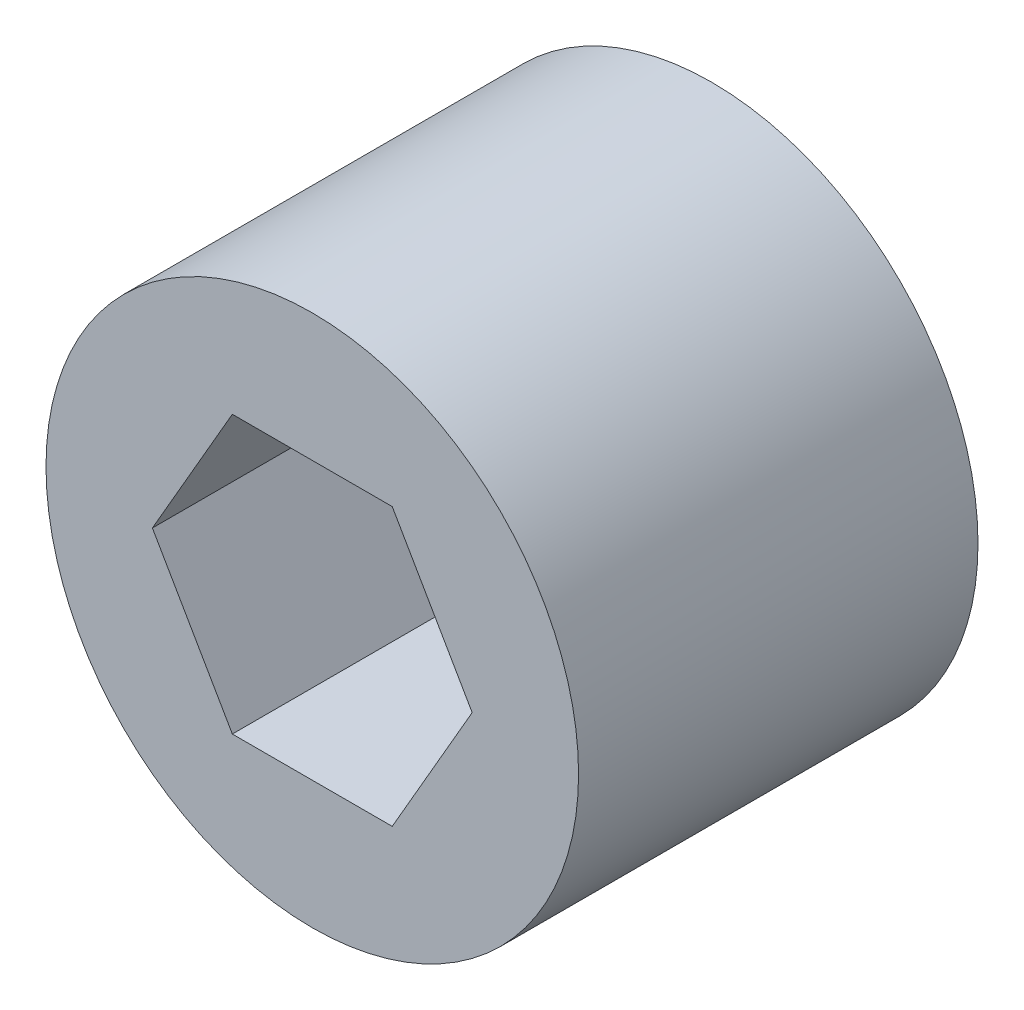
ISO-10303-21;
HEADER;
FILE_DESCRIPTION(('STEP AP214'),'2;1');
FILE_NAME('part.step','',(''),(''),'','','');
FILE_SCHEMA(('AUTOMOTIVE_DESIGN { 1 0 10303 214 1 1 1 1 }'));
ENDSEC;
DATA;
#1=APPLICATION_CONTEXT('core data for automotive mechanical design processes');
#2=APPLICATION_PROTOCOL_DEFINITION('international standard','automotive_design',2000,#1);
#3=PRODUCT_CONTEXT('',#1,'mechanical');
#4=PRODUCT('Part','Part','',(#3));
#5=PRODUCT_RELATED_PRODUCT_CATEGORY('part','',(#4));
#6=PRODUCT_DEFINITION_FORMATION('','',#4);
#7=PRODUCT_DEFINITION_CONTEXT('part definition',#1,'design');
#8=PRODUCT_DEFINITION('design','',#6,#7);
#9=PRODUCT_DEFINITION_SHAPE('','',#8);
#10=(LENGTH_UNIT() NAMED_UNIT(*) SI_UNIT(.MILLI.,.METRE.));
#11=(NAMED_UNIT(*) PLANE_ANGLE_UNIT() SI_UNIT($,.RADIAN.));
#12=(NAMED_UNIT(*) SI_UNIT($,.STERADIAN.) SOLID_ANGLE_UNIT());
#13=UNCERTAINTY_MEASURE_WITH_UNIT(LENGTH_MEASURE(1.E-05),#10,'distance_accuracy_value','');
#14=(GEOMETRIC_REPRESENTATION_CONTEXT(3) GLOBAL_UNCERTAINTY_ASSIGNED_CONTEXT((#13)) GLOBAL_UNIT_ASSIGNED_CONTEXT((#10,
#11,#12)) REPRESENTATION_CONTEXT('',''));
#15=CARTESIAN_POINT('',(0.,0.,0.));
#16=DIRECTION('',(0.,0.,1.));
#17=DIRECTION('',(1.,0.,0.));
#18=AXIS2_PLACEMENT_3D('',#15,#16,#17);
#19=CARTESIAN_POINT('',(0.,0.,19.05));
#20=DIRECTION('',(0.,0.,1.));
#21=DIRECTION('',(1.,0.,0.));
#22=AXIS2_PLACEMENT_3D('',#19,#20,#21);
#23=PLANE('',#22);
#24=CARTESIAN_POINT('',(0.,0.,19.05));
#25=DIRECTION('',(0.,0.,1.));
#26=DIRECTION('',(1.,0.,0.));
#27=AXIS2_PLACEMENT_3D('',#24,#25,#26);
#28=CIRCLE('',#27,12.7);
#29=CARTESIAN_POINT('',(-12.7,0.,19.05));
#30=VERTEX_POINT('',#29);
#31=EDGE_CURVE('E11',#30,#30,#28,.T.);
#32=ORIENTED_EDGE('',*,*,#31,.T.);
#33=EDGE_LOOP('',(#32));
#34=FACE_BOUND('',#33,.T.);
#35=DIRECTION('',(0.5,0.866025403784438,0.));
#36=VECTOR('',#35,1.);
#37=CARTESIAN_POINT('',(3.81282117772829,-6.604,19.05));
#38=LINE('',#37,#36);
#39=CARTESIAN_POINT('',(3.81282117772829,-6.604,19.05));
#40=VERTEX_POINT('',#39);
#41=CARTESIAN_POINT('',(7.62564235545658,0.,19.05));
#42=VERTEX_POINT('',#41);
#43=EDGE_CURVE('E98',#40,#42,#38,.T.);
#44=ORIENTED_EDGE('',*,*,#43,.F.);
#45=DIRECTION('',(1.,0.,0.));
#46=VECTOR('',#45,1.);
#47=CARTESIAN_POINT('',(-3.81282117772829,-6.604,19.05));
#48=LINE('',#47,#46);
#49=CARTESIAN_POINT('',(-3.81282117772829,-6.604,19.05));
#50=VERTEX_POINT('',#49);
#51=EDGE_CURVE('E90',#50,#40,#48,.T.);
#52=ORIENTED_EDGE('',*,*,#51,.F.);
#53=DIRECTION('',(0.5,-0.866025403784439,0.));
#54=VECTOR('',#53,1.);
#55=CARTESIAN_POINT('',(-7.62564235545658,0.,19.05));
#56=LINE('',#55,#54);
#57=CARTESIAN_POINT('',(-7.62564235545658,0.,19.05));
#58=VERTEX_POINT('',#57);
#59=EDGE_CURVE('E118',#58,#50,#56,.T.);
#60=ORIENTED_EDGE('',*,*,#59,.F.);
#61=DIRECTION('',(-0.5,-0.866025403784438,0.));
#62=VECTOR('',#61,1.);
#63=CARTESIAN_POINT('',(-3.81282117772829,6.604,19.05));
#64=LINE('',#63,#62);
#65=CARTESIAN_POINT('',(-3.81282117772829,6.604,19.05));
#66=VERTEX_POINT('',#65);
#67=EDGE_CURVE('E116',#66,#58,#64,.T.);
#68=ORIENTED_EDGE('',*,*,#67,.F.);
#69=DIRECTION('',(-1.,0.,0.));
#70=VECTOR('',#69,1.);
#71=CARTESIAN_POINT('',(3.81282117772829,6.604,19.05));
#72=LINE('',#71,#70);
#73=CARTESIAN_POINT('',(3.81282117772829,6.604,19.05));
#74=VERTEX_POINT('',#73);
#75=EDGE_CURVE('E112',#74,#66,#72,.T.);
#76=ORIENTED_EDGE('',*,*,#75,.F.);
#77=DIRECTION('',(-0.5,0.866025403784439,0.));
#78=VECTOR('',#77,1.);
#79=CARTESIAN_POINT('',(7.62564235545658,0.,19.05));
#80=LINE('',#79,#78);
#81=EDGE_CURVE('E110',#42,#74,#80,.T.);
#82=ORIENTED_EDGE('',*,*,#81,.F.);
#83=EDGE_LOOP('',(#44,#52,#60,#68,#76,#82));
#84=FACE_BOUND('',#83,.T.);
#85=ADVANCED_FACE('F37',(#34,#84),#23,.T.);
#86=CARTESIAN_POINT('',(0.,0.,0.));
#87=DIRECTION('',(0.,0.,1.));
#88=DIRECTION('',(1.,0.,0.));
#89=AXIS2_PLACEMENT_3D('',#86,#87,#88);
#90=PLANE('',#89);
#91=CARTESIAN_POINT('',(0.,0.,0.));
#92=DIRECTION('',(0.,0.,1.));
#93=DIRECTION('',(1.,0.,0.));
#94=AXIS2_PLACEMENT_3D('',#91,#92,#93);
#95=CIRCLE('',#94,12.7);
#96=CARTESIAN_POINT('',(-12.7,0.,0.));
#97=VERTEX_POINT('',#96);
#98=EDGE_CURVE('E41',#97,#97,#95,.T.);
#99=ORIENTED_EDGE('',*,*,#98,.F.);
#100=EDGE_LOOP('',(#99));
#101=FACE_BOUND('',#100,.T.);
#102=DIRECTION('',(1.,0.,0.));
#103=VECTOR('',#102,1.);
#104=CARTESIAN_POINT('',(-3.81282117772829,-6.604,0.));
#105=LINE('',#104,#103);
#106=CARTESIAN_POINT('',(-3.81282117772829,-6.604,0.));
#107=VERTEX_POINT('',#106);
#108=CARTESIAN_POINT('',(3.81282117772829,-6.604,0.));
#109=VERTEX_POINT('',#108);
#110=EDGE_CURVE('E60',#107,#109,#105,.T.);
#111=ORIENTED_EDGE('',*,*,#110,.T.);
#112=DIRECTION('',(0.5,0.866025403784438,0.));
#113=VECTOR('',#112,1.);
#114=CARTESIAN_POINT('',(3.81282117772829,-6.604,0.));
#115=LINE('',#114,#113);
#116=CARTESIAN_POINT('',(7.62564235545658,0.,0.));
#117=VERTEX_POINT('',#116);
#118=EDGE_CURVE('E105',#109,#117,#115,.T.);
#119=ORIENTED_EDGE('',*,*,#118,.T.);
#120=DIRECTION('',(-0.5,0.866025403784439,0.));
#121=VECTOR('',#120,1.);
#122=CARTESIAN_POINT('',(7.62564235545658,0.,0.));
#123=LINE('',#122,#121);
#124=CARTESIAN_POINT('',(3.81282117772829,6.604,0.));
#125=VERTEX_POINT('',#124);
#126=EDGE_CURVE('E122',#117,#125,#123,.T.);
#127=ORIENTED_EDGE('',*,*,#126,.T.);
#128=DIRECTION('',(-1.,0.,0.));
#129=VECTOR('',#128,1.);
#130=CARTESIAN_POINT('',(3.81282117772829,6.604,0.));
#131=LINE('',#130,#129);
#132=CARTESIAN_POINT('',(-3.81282117772829,6.604,0.));
#133=VERTEX_POINT('',#132);
#134=EDGE_CURVE('E125',#125,#133,#131,.T.);
#135=ORIENTED_EDGE('',*,*,#134,.T.);
#136=DIRECTION('',(-0.5,-0.866025403784438,0.));
#137=VECTOR('',#136,1.);
#138=CARTESIAN_POINT('',(-3.81282117772829,6.604,0.));
#139=LINE('',#138,#137);
#140=CARTESIAN_POINT('',(-7.62564235545658,0.,0.));
#141=VERTEX_POINT('',#140);
#142=EDGE_CURVE('E128',#133,#141,#139,.T.);
#143=ORIENTED_EDGE('',*,*,#142,.T.);
#144=DIRECTION('',(0.5,-0.866025403784439,0.));
#145=VECTOR('',#144,1.);
#146=CARTESIAN_POINT('',(-7.62564235545658,0.,0.));
#147=LINE('',#146,#145);
#148=EDGE_CURVE('E99',#141,#107,#147,.T.);
#149=ORIENTED_EDGE('',*,*,#148,.T.);
#150=EDGE_LOOP('',(#111,#119,#127,#135,#143,#149));
#151=FACE_BOUND('',#150,.T.);
#152=ADVANCED_FACE('F145',(#101,#151),#90,.F.);
#153=CARTESIAN_POINT('',(0.,0.,19.05));
#154=DIRECTION('',(0.,0.,-1.));
#155=DIRECTION('',(-1.,0.,0.));
#156=AXIS2_PLACEMENT_3D('',#153,#154,#155);
#157=CYLINDRICAL_SURFACE('',#156,12.7);
#158=CARTESIAN_POINT('',(-12.7,0.,19.05));
#159=CARTESIAN_POINT('',(-12.7,0.,18.8515625));
#160=CARTESIAN_POINT('',(-12.7,0.,18.653125));
#161=CARTESIAN_POINT('',(-12.7,0.,18.25625));
#162=CARTESIAN_POINT('',(-12.7,0.,18.0578125));
#163=CARTESIAN_POINT('',(-12.7,0.,17.6609375));
#164=CARTESIAN_POINT('',(-12.7,0.,17.4625));
#165=CARTESIAN_POINT('',(-12.7,0.,17.065625));
#166=CARTESIAN_POINT('',(-12.7,0.,16.8671875));
#167=CARTESIAN_POINT('',(-12.7,0.,16.4703125));
#168=CARTESIAN_POINT('',(-12.7,0.,16.271875));
#169=CARTESIAN_POINT('',(-12.7,0.,15.875));
#170=CARTESIAN_POINT('',(-12.7,0.,15.6765625));
#171=CARTESIAN_POINT('',(-12.7,0.,15.2796875));
#172=CARTESIAN_POINT('',(-12.7,0.,15.08125));
#173=CARTESIAN_POINT('',(-12.7,0.,14.684375));
#174=CARTESIAN_POINT('',(-12.7,0.,14.4859375));
#175=CARTESIAN_POINT('',(-12.7,0.,14.0890625));
#176=CARTESIAN_POINT('',(-12.7,0.,13.890625));
#177=CARTESIAN_POINT('',(-12.7,0.,13.49375));
#178=CARTESIAN_POINT('',(-12.7,0.,13.2953125));
#179=CARTESIAN_POINT('',(-12.7,0.,12.8984375));
#180=CARTESIAN_POINT('',(-12.7,0.,12.7));
#181=CARTESIAN_POINT('',(-12.7,0.,12.303125));
#182=CARTESIAN_POINT('',(-12.7,0.,12.1046875));
#183=CARTESIAN_POINT('',(-12.7,0.,11.7078125));
#184=CARTESIAN_POINT('',(-12.7,0.,11.509375));
#185=CARTESIAN_POINT('',(-12.7,0.,11.1125));
#186=CARTESIAN_POINT('',(-12.7,0.,10.9140625));
#187=CARTESIAN_POINT('',(-12.7,0.,10.5171875));
#188=CARTESIAN_POINT('',(-12.7,0.,10.31875));
#189=CARTESIAN_POINT('',(-12.7,0.,9.921875));
#190=CARTESIAN_POINT('',(-12.7,0.,9.7234375));
#191=CARTESIAN_POINT('',(-12.7,0.,9.3265625));
#192=CARTESIAN_POINT('',(-12.7,0.,9.128125));
#193=CARTESIAN_POINT('',(-12.7,0.,8.73125));
#194=CARTESIAN_POINT('',(-12.7,0.,8.5328125));
#195=CARTESIAN_POINT('',(-12.7,0.,8.1359375));
#196=CARTESIAN_POINT('',(-12.7,0.,7.9375));
#197=CARTESIAN_POINT('',(-12.7,0.,7.540625));
#198=CARTESIAN_POINT('',(-12.7,0.,7.3421875));
#199=CARTESIAN_POINT('',(-12.7,0.,6.9453125));
#200=CARTESIAN_POINT('',(-12.7,0.,6.746875));
#201=CARTESIAN_POINT('',(-12.7,0.,6.35));
#202=CARTESIAN_POINT('',(-12.7,0.,6.1515625));
#203=CARTESIAN_POINT('',(-12.7,0.,5.7546875));
#204=CARTESIAN_POINT('',(-12.7,0.,5.55625));
#205=CARTESIAN_POINT('',(-12.7,0.,5.159375));
#206=CARTESIAN_POINT('',(-12.7,0.,4.9609375));
#207=CARTESIAN_POINT('',(-12.7,0.,4.5640625));
#208=CARTESIAN_POINT('',(-12.7,0.,4.365625));
#209=CARTESIAN_POINT('',(-12.7,0.,3.96875));
#210=CARTESIAN_POINT('',(-12.7,0.,3.7703125));
#211=CARTESIAN_POINT('',(-12.7,0.,3.3734375));
#212=CARTESIAN_POINT('',(-12.7,0.,3.175));
#213=CARTESIAN_POINT('',(-12.7,0.,2.778125));
#214=CARTESIAN_POINT('',(-12.7,0.,2.5796875));
#215=CARTESIAN_POINT('',(-12.7,0.,2.1828125));
#216=CARTESIAN_POINT('',(-12.7,0.,1.984375));
#217=CARTESIAN_POINT('',(-12.7,0.,1.5875));
#218=CARTESIAN_POINT('',(-12.7,0.,1.3890625));
#219=CARTESIAN_POINT('',(-12.7,0.,0.992187500000001));
#220=CARTESIAN_POINT('',(-12.7,0.,0.793750000000001));
#221=CARTESIAN_POINT('',(-12.7,0.,0.396875));
#222=CARTESIAN_POINT('',(-12.7,0.,0.1984375));
#223=CARTESIAN_POINT('',(-12.7,0.,0.));
#224=B_SPLINE_CURVE_WITH_KNOTS('',3,(#158,#159,#160,#161,#162,#163,#164,#165,#166,#167,#168,
#169,#170,#171,#172,#173,#174,#175,#176,#177,#178,#179,#180,#181,#182,#183,#184,#185,#186,#187,
#188,#189,#190,#191,#192,#193,#194,#195,#196,#197,#198,#199,#200,#201,#202,#203,#204,#205,#206,
#207,#208,#209,#210,#211,#212,#213,#214,#215,#216,#217,#218,#219,#220,#221,#222,#223),
.UNSPECIFIED.,.F.,.F.,(4,2,2,2,2,2,2,2,2,2,2,2,2,2,2,2,2,2,2,2,2,2,2,2,2,2,2,2,2,2,2,2,4),(0.,
0.595312499999997,1.190625,1.7859375,2.38125,2.9765625,3.571875,4.1671875,4.7625,5.3578125,
5.953125,6.5484375,7.14375,7.7390625,8.334375,8.9296875,9.525,10.1203125,10.715625,11.3109375,
11.90625,12.5015625,13.096875,13.6921875,14.2875,14.8828125,15.478125,16.0734375,16.66875,
17.2640625,17.859375,18.4546875,19.05),.UNSPECIFIED.);
#225=EDGE_CURVE('BSEAM39',#30,#97,#224,.T.);
#226=ORIENTED_EDGE('',*,*,#31,.F.);
#227=ORIENTED_EDGE('',*,*,#98,.T.);
#228=ORIENTED_EDGE('',*,*,#225,.T.);
#229=ORIENTED_EDGE('',*,*,#225,.F.);
#230=EDGE_LOOP('',(#226,#228,#227,#229));
#231=FACE_BOUND('',#230,.T.);
#232=ADVANCED_FACE('F39',(#231),#157,.T.);
#233=CARTESIAN_POINT('',(-3.81282117772829,-6.604,19.05));
#234=DIRECTION('',(0.,1.,0.));
#235=DIRECTION('',(0.,0.,1.));
#236=AXIS2_PLACEMENT_3D('',#233,#234,#235);
#237=PLANE('',#236);
#238=ORIENTED_EDGE('',*,*,#110,.F.);
#239=DIRECTION('',(0.,0.,-1.));
#240=VECTOR('',#239,1.);
#241=CARTESIAN_POINT('',(-3.81282117772829,-6.604,19.05));
#242=LINE('',#241,#240);
#243=EDGE_CURVE('E94',#50,#107,#242,.T.);
#244=ORIENTED_EDGE('',*,*,#243,.F.);
#245=ORIENTED_EDGE('',*,*,#51,.T.);
#246=DIRECTION('',(0.,0.,-1.));
#247=VECTOR('',#246,1.);
#248=CARTESIAN_POINT('',(3.81282117772829,-6.604,19.05));
#249=LINE('',#248,#247);
#250=EDGE_CURVE('E93',#40,#109,#249,.T.);
#251=ORIENTED_EDGE('',*,*,#250,.T.);
#252=EDGE_LOOP('',(#238,#244,#245,#251));
#253=FACE_BOUND('',#252,.T.);
#254=ADVANCED_FACE('F92',(#253),#237,.T.);
#255=CARTESIAN_POINT('',(3.81282117772829,-6.604,19.05));
#256=DIRECTION('',(-0.866025403784439,0.5,0.));
#257=DIRECTION('',(-0.5,-0.866025403784438,0.));
#258=AXIS2_PLACEMENT_3D('',#255,#256,#257);
#259=PLANE('',#258);
#260=ORIENTED_EDGE('',*,*,#118,.F.);
#261=ORIENTED_EDGE('',*,*,#250,.F.);
#262=ORIENTED_EDGE('',*,*,#43,.T.);
#263=DIRECTION('',(0.,0.,-1.));
#264=VECTOR('',#263,1.);
#265=CARTESIAN_POINT('',(7.62564235545658,0.,19.05));
#266=LINE('',#265,#264);
#267=EDGE_CURVE('E106',#42,#117,#266,.T.);
#268=ORIENTED_EDGE('',*,*,#267,.T.);
#269=EDGE_LOOP('',(#260,#261,#262,#268));
#270=FACE_BOUND('',#269,.T.);
#271=ADVANCED_FACE('F102',(#270),#259,.T.);
#272=CARTESIAN_POINT('',(7.62564235545658,0.,19.05));
#273=DIRECTION('',(-0.866025403784439,-0.5,0.));
#274=DIRECTION('',(0.5,-0.866025403784439,0.));
#275=AXIS2_PLACEMENT_3D('',#272,#273,#274);
#276=PLANE('',#275);
#277=ORIENTED_EDGE('',*,*,#126,.F.);
#278=ORIENTED_EDGE('',*,*,#267,.F.);
#279=ORIENTED_EDGE('',*,*,#81,.T.);
#280=DIRECTION('',(0.,0.,-1.));
#281=VECTOR('',#280,1.);
#282=CARTESIAN_POINT('',(3.81282117772829,6.604,19.05));
#283=LINE('',#282,#281);
#284=EDGE_CURVE('E137',#74,#125,#283,.T.);
#285=ORIENTED_EDGE('',*,*,#284,.T.);
#286=EDGE_LOOP('',(#277,#278,#279,#285));
#287=FACE_BOUND('',#286,.T.);
#288=ADVANCED_FACE('F141',(#287),#276,.T.);
#289=CARTESIAN_POINT('',(3.81282117772829,6.604,19.05));
#290=DIRECTION('',(0.,-1.,0.));
#291=DIRECTION('',(1.,0.,0.));
#292=AXIS2_PLACEMENT_3D('',#289,#290,#291);
#293=PLANE('',#292);
#294=ORIENTED_EDGE('',*,*,#134,.F.);
#295=ORIENTED_EDGE('',*,*,#284,.F.);
#296=ORIENTED_EDGE('',*,*,#75,.T.);
#297=DIRECTION('',(0.,0.,-1.));
#298=VECTOR('',#297,1.);
#299=CARTESIAN_POINT('',(-3.81282117772829,6.604,19.05));
#300=LINE('',#299,#298);
#301=EDGE_CURVE('E135',#66,#133,#300,.T.);
#302=ORIENTED_EDGE('',*,*,#301,.T.);
#303=EDGE_LOOP('',(#294,#295,#296,#302));
#304=FACE_BOUND('',#303,.T.);
#305=ADVANCED_FACE('F153',(#304),#293,.T.);
#306=CARTESIAN_POINT('',(-3.81282117772829,6.604,19.05));
#307=DIRECTION('',(0.866025403784439,-0.5,0.));
#308=DIRECTION('',(0.5,0.866025403784438,0.));
#309=AXIS2_PLACEMENT_3D('',#306,#307,#308);
#310=PLANE('',#309);
#311=ORIENTED_EDGE('',*,*,#142,.F.);
#312=ORIENTED_EDGE('',*,*,#301,.F.);
#313=ORIENTED_EDGE('',*,*,#67,.T.);
#314=DIRECTION('',(0.,0.,-1.));
#315=VECTOR('',#314,1.);
#316=CARTESIAN_POINT('',(-7.62564235545658,0.,19.05));
#317=LINE('',#316,#315);
#318=EDGE_CURVE('E52',#58,#141,#317,.T.);
#319=ORIENTED_EDGE('',*,*,#318,.T.);
#320=EDGE_LOOP('',(#311,#312,#313,#319));
#321=FACE_BOUND('',#320,.T.);
#322=ADVANCED_FACE('F151',(#321),#310,.T.);
#323=CARTESIAN_POINT('',(-7.62564235545658,0.,19.05));
#324=DIRECTION('',(0.866025403784439,0.5,0.));
#325=DIRECTION('',(-0.5,0.866025403784439,0.));
#326=AXIS2_PLACEMENT_3D('',#323,#324,#325);
#327=PLANE('',#326);
#328=ORIENTED_EDGE('',*,*,#148,.F.);
#329=ORIENTED_EDGE('',*,*,#318,.F.);
#330=ORIENTED_EDGE('',*,*,#59,.T.);
#331=ORIENTED_EDGE('',*,*,#243,.T.);
#332=EDGE_LOOP('',(#328,#329,#330,#331));
#333=FACE_BOUND('',#332,.T.);
#334=ADVANCED_FACE('F147',(#333),#327,.T.);
#335=CLOSED_SHELL('',(#85,#152,#232,#254,#271,#288,#305,#322,#334));
#336=MANIFOLD_SOLID_BREP('B2',#335);
#337=ADVANCED_BREP_SHAPE_REPRESENTATION('',(#18,#336),#14);
#338=SHAPE_DEFINITION_REPRESENTATION(#9,#337);
ENDSEC;
END-ISO-10303-21;
